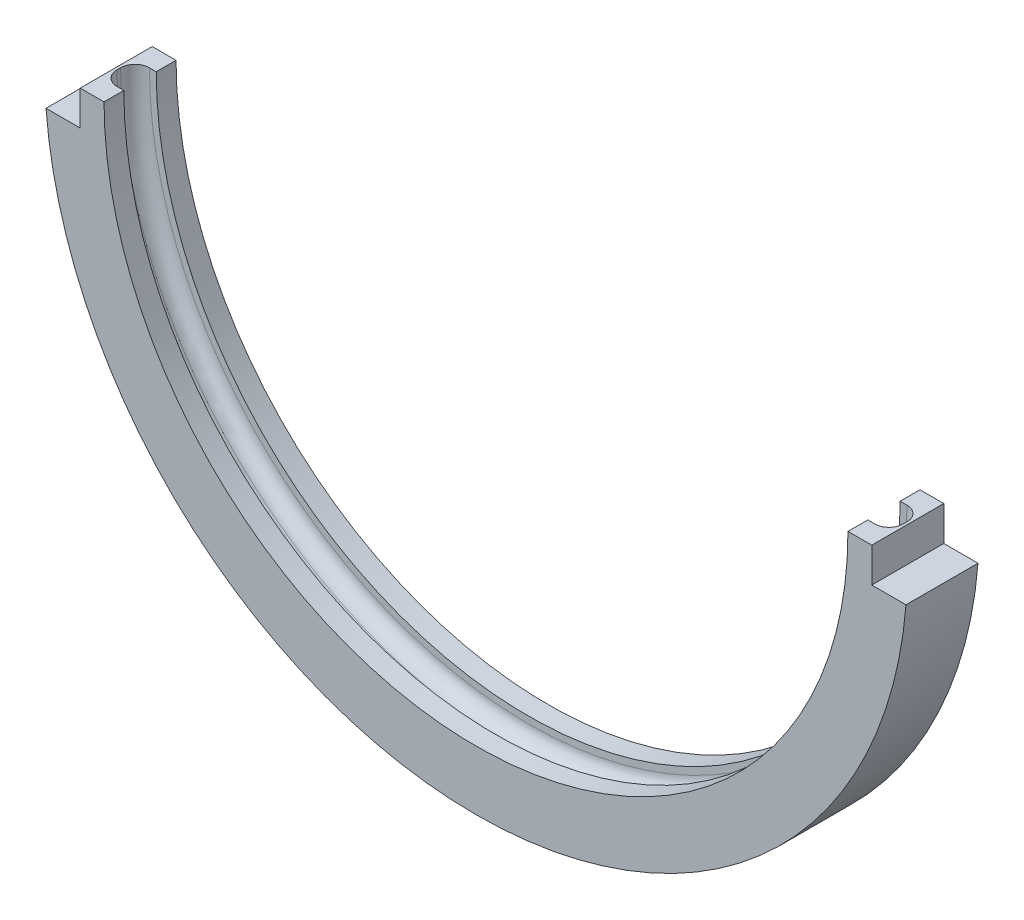
ISO-10303-21;
HEADER;
FILE_DESCRIPTION(('STEP AP214'),'2;1');
FILE_NAME('part.step','',(''),(''),'','','');
FILE_SCHEMA(('AUTOMOTIVE_DESIGN { 1 0 10303 214 1 1 1 1 }'));
ENDSEC;
DATA;
#1=APPLICATION_CONTEXT('core data for automotive mechanical design processes');
#2=APPLICATION_PROTOCOL_DEFINITION('international standard','automotive_design',2000,#1);
#3=PRODUCT_CONTEXT('',#1,'mechanical');
#4=PRODUCT('Part','Part','',(#3));
#5=PRODUCT_RELATED_PRODUCT_CATEGORY('part','',(#4));
#6=PRODUCT_DEFINITION_FORMATION('','',#4);
#7=PRODUCT_DEFINITION_CONTEXT('part definition',#1,'design');
#8=PRODUCT_DEFINITION('design','',#6,#7);
#9=PRODUCT_DEFINITION_SHAPE('','',#8);
#10=(LENGTH_UNIT() NAMED_UNIT(*) SI_UNIT(.MILLI.,.METRE.));
#11=(NAMED_UNIT(*) PLANE_ANGLE_UNIT() SI_UNIT($,.RADIAN.));
#12=(NAMED_UNIT(*) SI_UNIT($,.STERADIAN.) SOLID_ANGLE_UNIT());
#13=UNCERTAINTY_MEASURE_WITH_UNIT(LENGTH_MEASURE(1.E-05),#10,'distance_accuracy_value','');
#14=(GEOMETRIC_REPRESENTATION_CONTEXT(3) GLOBAL_UNCERTAINTY_ASSIGNED_CONTEXT((#13)) GLOBAL_UNIT_ASSIGNED_CONTEXT((#10,
#11,#12)) REPRESENTATION_CONTEXT('',''));
#15=CARTESIAN_POINT('',(0.,0.,0.));
#16=DIRECTION('',(0.,0.,1.));
#17=DIRECTION('',(1.,0.,0.));
#18=AXIS2_PLACEMENT_3D('',#15,#16,#17);
#19=CARTESIAN_POINT('',(0.,76.073,5.715));
#20=DIRECTION('',(0.,0.,-1.));
#21=DIRECTION('',(-1.,0.,0.));
#22=AXIS2_PLACEMENT_3D('',#19,#20,#21);
#23=CYLINDRICAL_SURFACE('',#22,76.073);
#24=CARTESIAN_POINT('',(0.,0.,1.33349999999999));
#25=CARTESIAN_POINT('',(0.0855945349997394,2.06101865915867E-07,1.33350379291589));
#26=CARTESIAN_POINT('',(0.171250915498614,0.000146012248360919,1.34073524768457));
#27=CARTESIAN_POINT('',(0.340204023150751,0.00071364506222568,1.36948225182749));
#28=CARTESIAN_POINT('',(0.423497794593289,0.00113580282824444,1.39101493604841));
#29=CARTESIAN_POINT('',(0.58525356893735,0.00220832220925467,1.44775060002442));
#30=CARTESIAN_POINT('',(0.663717883442069,0.00285857363366933,1.48294697981084));
#31=CARTESIAN_POINT('',(0.813602096244806,0.0043138981059449,1.56600169332678));
#32=CARTESIAN_POINT('',(0.885023725956289,0.00511893295668781,1.61385690423012));
#33=CARTESIAN_POINT('',(1.01883757249064,0.00679340697851409,1.72088761442366));
#34=CARTESIAN_POINT('',(1.08122770917481,0.00766286091714674,1.78006571434437));
#35=CARTESIAN_POINT('',(1.19519031708527,0.0093680471323975,1.90805861859076));
#36=CARTESIAN_POINT('',(1.24676236082598,0.010203778075371,1.97687380355443));
#37=CARTESIAN_POINT('',(1.3376251451231,0.0117473104519163,2.12219141461824));
#38=CARTESIAN_POINT('',(1.37691508154246,0.0124551035078293,2.19869434361906));
#39=CARTESIAN_POINT('',(1.44209293399731,0.0136628632197349,2.35721212766005));
#40=CARTESIAN_POINT('',(1.46798088892473,0.0141628304788274,2.43922696670414));
#41=CARTESIAN_POINT('',(1.50561666142446,0.0148984887564408,2.60642887018513));
#42=CARTESIAN_POINT('',(1.51736637556974,0.0151342152212277,2.69161550756052));
#43=CARTESIAN_POINT('',(1.52639796106279,0.0153149207245114,2.8627524189173));
#44=CARTESIAN_POINT('',(1.52367987260578,0.0152599005707755,2.94870269077645));
#45=CARTESIAN_POINT('',(1.50385466040848,0.0148653504340099,3.11891417148759));
#46=CARTESIAN_POINT('',(1.48674959902126,0.0145258612292591,3.20317562065764));
#47=CARTESIAN_POINT('',(1.43863917290202,0.0136007098296155,3.3676307436008));
#48=CARTESIAN_POINT('',(1.40763378638577,0.0130150472489263,3.44782441099877));
#49=CARTESIAN_POINT('',(1.33260048235792,0.0116635275432489,3.60187411392825));
#50=CARTESIAN_POINT('',(1.28857161888797,0.0108976573297322,3.67572968859041));
#51=CARTESIAN_POINT('',(1.18874191287519,0.00927207813996294,3.81500161578621));
#52=CARTESIAN_POINT('',(1.13294106097371,0.00841236908910922,3.88041796161065));
#53=CARTESIAN_POINT('',(1.01113968026977,0.00669585093085855,4.00096653225274));
#54=CARTESIAN_POINT('',(0.945137359360457,0.0058390423600706,4.05609694636289));
#55=CARTESIAN_POINT('',(0.804812955805773,0.00422506510297776,4.15449474589157));
#56=CARTESIAN_POINT('',(0.730490871968146,0.00346789643095172,4.19776212961007));
#57=CARTESIAN_POINT('',(0.575635722257035,0.00213855432188997,4.27120543008588));
#58=CARTESIAN_POINT('',(0.495102630444092,0.00156638165751761,4.30138129216468));
#59=CARTESIAN_POINT('',(0.330111987568197,0.000671548269268094,4.34778380786271));
#60=CARTESIAN_POINT('',(0.245654441366153,0.000348887236349569,4.3640104787592));
#61=CARTESIAN_POINT('',(0.0752280970382326,-1.05092405947312E-05,4.38205177674906));
#62=CARTESIAN_POINT('',(-0.0107404358431765,-4.72943757394238E-05,4.38386890851823));
#63=CARTESIAN_POINT('',(-0.181762198594427,0.000169076345192388,4.37304606986865));
#64=CARTESIAN_POINT('',(-0.266815428914038,0.000422232058788883,4.36040610655427));
#65=CARTESIAN_POINT('',(-0.433585227687398,0.0011899157446135,4.32102995718912));
#66=CARTESIAN_POINT('',(-0.515302064212906,0.00170442267303155,4.29429490605803));
#67=CARTESIAN_POINT('',(-0.673087615387558,0.00293681524962359,4.22748865692274));
#68=CARTESIAN_POINT('',(-0.749156325373015,0.00365470106572617,4.18741744790695));
#69=CARTESIAN_POINT('',(-0.893497817923817,0.00521306827912535,4.09506991635602));
#70=CARTESIAN_POINT('',(-0.961769521065522,0.00605356661440183,4.04279190694471));
#71=CARTESIAN_POINT('',(-1.08856816644544,0.00776235857443175,3.92751724418561));
#72=CARTESIAN_POINT('',(-1.14709509541133,0.00863065223704034,3.86452057623931));
#73=CARTESIAN_POINT('',(-1.25275113682792,0.0102972860680389,3.72958614285633));
#74=CARTESIAN_POINT('',(-1.2998786325906,0.0110956163038644,3.65764711138529));
#75=CARTESIAN_POINT('',(-1.38138693581098,0.012532160014725,3.50687658683567));
#76=CARTESIAN_POINT('',(-1.41576776354565,0.0131703737444674,3.4280451047216));
#77=CARTESIAN_POINT('',(-1.47080396987324,0.0142146587671107,3.26573353617285));
#78=CARTESIAN_POINT('',(-1.49146040078931,0.0146207478579197,3.18225380667632));
#79=CARTESIAN_POINT('',(-1.51846491163559,0.015155049642882,3.01301030152232));
#80=CARTESIAN_POINT('',(-1.52481298287515,0.0152832621682579,2.92724652447759));
#81=CARTESIAN_POINT('',(-1.5230204201675,0.0152473484650301,2.75588581915875));
#82=CARTESIAN_POINT('',(-1.51488234856612,0.0150832739369008,2.67028886405773));
#83=CARTESIAN_POINT('',(-1.4843537508379,0.0144813917127718,2.50167631198362));
#84=CARTESIAN_POINT('',(-1.46196319621411,0.0140435834694591,2.41866072017216));
#85=CARTESIAN_POINT('',(-1.40356528137836,0.0129435925449101,2.25756570290613));
#86=CARTESIAN_POINT('',(-1.36755767518963,0.0122814058105504,2.17948636664921));
#87=CARTESIAN_POINT('',(-1.28294952090296,0.0108073427394373,2.03048353282782));
#88=CARTESIAN_POINT('',(-1.23434944982934,0.00999547207330576,1.95955976433944));
#89=CARTESIAN_POINT('',(-1.12593166801518,0.00831346202115557,1.82687158382607));
#90=CARTESIAN_POINT('',(-1.06611316687766,0.00744331853229102,1.76510781772051));
#91=CARTESIAN_POINT('',(-0.936938606354715,0.00574266821983038,1.65248329537931));
#92=CARTESIAN_POINT('',(-0.867580184106196,0.00491217128481854,1.60162524830068));
#93=CARTESIAN_POINT('',(-0.721275855637611,0.00338424251398353,1.51225182287018));
#94=CARTESIAN_POINT('',(-0.644325772223447,0.00268688456219293,1.47374328973678));
#95=CARTESIAN_POINT('',(-0.485111216277927,0.00150529078577328,1.41023637854843));
#96=CARTESIAN_POINT('',(-0.402853232344317,0.00102080019868899,1.38522184248434));
#97=CARTESIAN_POINT('',(-0.266727553014035,0.00044943552346389,1.35606306091305));
#98=CARTESIAN_POINT('',(-0.213743956090708,0.000281625570785505,1.34761251136189));
#99=CARTESIAN_POINT('',(-0.10718165758212,5.68432813400188E-05,1.33632979362654));
#100=CARTESIAN_POINT('',(-0.0536029560740152,-1.29069797102052E-07,1.33349762471394));
#101=CARTESIAN_POINT('',(0.,0.,1.33349999999999));
#102=B_SPLINE_CURVE_WITH_KNOTS('',3,(#24,#25,#26,#27,#28,#29,#30,#31,#32,#33,#34,#35,#36,#37,
#38,#39,#40,#41,#42,#43,#44,#45,#46,#47,#48,#49,#50,#51,#52,#53,#54,#55,#56,#57,#58,#59,#60,#61,
#62,#63,#64,#65,#66,#67,#68,#69,#70,#71,#72,#73,#74,#75,#76,#77,#78,#79,#80,#81,#82,#83,#84,#85,
#86,#87,#88,#89,#90,#91,#92,#93,#94,#95,#96,#97,#98,#99,#100,#101),.UNSPECIFIED.,.T.,.F.,(4,2,2,
2,2,2,2,2,2,2,2,2,2,2,2,2,2,2,2,2,2,2,2,2,2,2,2,2,2,2,2,2,2,2,2,2,2,2,4),(0.,0.256587951195914,
0.513483886104433,0.770255886772825,1.02696460294593,1.28373235066598,1.5405102428578,
1.79730494335351,2.0540988986388,2.31085840248152,2.56761719298187,2.82433918372928,
3.08106157680606,3.33780262145724,3.59454387021671,3.85133027245316,4.10811671148822,
4.36490422301619,4.62169141649049,4.87843397406325,5.13517640547004,5.3918981674388,
5.64862014138162,5.90537761313974,6.16213543459716,6.41892964858623,6.67572345407407,
6.9324975675299,7.18927183694585,7.44600069198828,7.70273006034533,7.95946406645213,
8.21618834845273,8.47293072481965,8.72973680644864,8.98668498820558,9.2433248077216,
9.40401117000277,9.56469751145107),.UNSPECIFIED.);
#103=CARTESIAN_POINT('',(0.,0.,1.33349999999999));
#104=VERTEX_POINT('',#103);
#105=EDGE_CURVE('E224',#104,#104,#102,.T.);
#106=ORIENTED_EDGE('',*,*,#105,.F.);
#107=EDGE_LOOP('',(#106));
#108=FACE_BOUND('',#107,.T.);
#109=DIRECTION('',(0.,0.,1.));
#110=VECTOR('',#109,1.);
#111=CARTESIAN_POINT('',(-75.8283595563032,69.9769999999999,-3.4925));
#112=LINE('',#111,#110);
#113=CARTESIAN_POINT('',(-75.8283595563032,69.9769999999999,-3.4925));
#114=VERTEX_POINT('',#113);
#115=CARTESIAN_POINT('',(-75.8283595563032,69.9769999999999,9.2075));
#116=VERTEX_POINT('',#115);
#117=EDGE_CURVE('E12',#114,#116,#112,.T.);
#118=ORIENTED_EDGE('',*,*,#117,.F.);
#119=CARTESIAN_POINT('',(0.,76.073,-3.4925));
#120=DIRECTION('',(0.,0.,-1.));
#121=DIRECTION('',(-1.,0.,0.));
#122=AXIS2_PLACEMENT_3D('',#119,#120,#121);
#123=CIRCLE('',#122,76.073);
#124=CARTESIAN_POINT('',(75.8283595563032,69.977,-3.4925));
#125=VERTEX_POINT('',#124);
#126=EDGE_CURVE('E292',#125,#114,#123,.T.);
#127=ORIENTED_EDGE('',*,*,#126,.F.);
#128=DIRECTION('',(0.,0.,-1.));
#129=VECTOR('',#128,1.);
#130=CARTESIAN_POINT('',(75.8283595563032,69.977,5.715));
#131=LINE('',#130,#129);
#132=CARTESIAN_POINT('',(75.8283595563032,69.977,9.2075));
#133=VERTEX_POINT('',#132);
#134=EDGE_CURVE('E197',#125,#133,#131,.F.);
#135=ORIENTED_EDGE('',*,*,#134,.T.);
#136=CARTESIAN_POINT('',(0.,76.073,9.2075));
#137=DIRECTION('',(0.,0.,1.));
#138=DIRECTION('',(1.,0.,0.));
#139=AXIS2_PLACEMENT_3D('',#136,#137,#138);
#140=CIRCLE('',#139,76.073);
#141=EDGE_CURVE('E294',#116,#133,#140,.T.);
#142=ORIENTED_EDGE('',*,*,#141,.F.);
#143=EDGE_LOOP('',(#118,#127,#135,#142));
#144=FACE_BOUND('',#143,.T.);
#145=ADVANCED_FACE('F87',(#108,#144),#23,.T.);
#146=CARTESIAN_POINT('',(0.,76.073,5.715));
#147=DIRECTION('',(0.,-1.,0.));
#148=DIRECTION('',(0.,0.,-1.));
#149=AXIS2_PLACEMENT_3D('',#146,#147,#148);
#150=PLANE('',#149);
#151=DIRECTION('',(0.,0.,1.));
#152=VECTOR('',#151,1.);
#153=CARTESIAN_POINT('',(-69.7958595563032,76.073,-3.4925));
#154=LINE('',#153,#152);
#155=CARTESIAN_POINT('',(-69.7958595563032,76.073,-3.4925));
#156=VERTEX_POINT('',#155);
#157=CARTESIAN_POINT('',(-69.7958595563032,76.073,9.2075));
#158=VERTEX_POINT('',#157);
#159=EDGE_CURVE('E187',#156,#158,#154,.T.);
#160=ORIENTED_EDGE('',*,*,#159,.T.);
#161=DIRECTION('',(-1.,0.,0.));
#162=VECTOR('',#161,1.);
#163=CARTESIAN_POINT('',(0.,76.073,9.2075));
#164=LINE('',#163,#162);
#165=CARTESIAN_POINT('',(-65.5955,76.073,9.2075));
#166=VERTEX_POINT('',#165);
#167=EDGE_CURVE('E211',#166,#158,#164,.T.);
#168=ORIENTED_EDGE('',*,*,#167,.F.);
#169=DIRECTION('',(0.,0.,-1.));
#170=VECTOR('',#169,1.);
#171=CARTESIAN_POINT('',(-65.5955,76.073,9.2075));
#172=LINE('',#171,#170);
#173=CARTESIAN_POINT('',(-65.5955,76.073,5.715));
#174=VERTEX_POINT('',#173);
#175=EDGE_CURVE('E196',#166,#174,#172,.T.);
#176=ORIENTED_EDGE('',*,*,#175,.T.);
#177=DIRECTION('',(-1.,0.,0.));
#178=VECTOR('',#177,1.);
#179=CARTESIAN_POINT('',(0.,76.073,5.715));
#180=LINE('',#179,#178);
#181=CARTESIAN_POINT('',(-66.802,76.073,5.715));
#182=VERTEX_POINT('',#181);
#183=EDGE_CURVE('E322',#174,#182,#180,.T.);
#184=ORIENTED_EDGE('',*,*,#183,.T.);
#185=CARTESIAN_POINT('',(-66.802,76.073,3.175));
#186=DIRECTION('',(0.,-1.,0.));
#187=DIRECTION('',(0.,0.,-1.));
#188=AXIS2_PLACEMENT_3D('',#185,#186,#187);
#189=CIRCLE('',#188,2.54);
#190=CARTESIAN_POINT('',(-69.342,76.073,3.175));
#191=VERTEX_POINT('',#190);
#192=EDGE_CURVE('E218',#182,#191,#189,.T.);
#193=ORIENTED_EDGE('',*,*,#192,.T.);
#194=DIRECTION('',(0.,0.,-1.));
#195=VECTOR('',#194,1.);
#196=CARTESIAN_POINT('',(-69.342,76.073,5.715));
#197=LINE('',#196,#195);
#198=CARTESIAN_POINT('',(-69.342,76.073,2.54));
#199=VERTEX_POINT('',#198);
#200=EDGE_CURVE('E213',#191,#199,#197,.T.);
#201=ORIENTED_EDGE('',*,*,#200,.T.);
#202=CARTESIAN_POINT('',(-66.802,76.073,2.54));
#203=DIRECTION('',(0.,-1.,0.));
#204=DIRECTION('',(0.,0.,-1.));
#205=AXIS2_PLACEMENT_3D('',#202,#203,#204);
#206=CIRCLE('',#205,2.54);
#207=CARTESIAN_POINT('',(-66.802,76.073,0.));
#208=VERTEX_POINT('',#207);
#209=EDGE_CURVE('E212',#199,#208,#206,.T.);
#210=ORIENTED_EDGE('',*,*,#209,.T.);
#211=DIRECTION('',(-1.,0.,0.));
#212=VECTOR('',#211,1.);
#213=CARTESIAN_POINT('',(0.,76.073,0.));
#214=LINE('',#213,#212);
#215=CARTESIAN_POINT('',(-65.5955,76.073,0.));
#216=VERTEX_POINT('',#215);
#217=EDGE_CURVE('E342',#216,#208,#214,.T.);
#218=ORIENTED_EDGE('',*,*,#217,.F.);
#219=DIRECTION('',(0.,0.,1.));
#220=VECTOR('',#219,1.);
#221=CARTESIAN_POINT('',(-65.5955,76.073,-3.4925));
#222=LINE('',#221,#220);
#223=CARTESIAN_POINT('',(-65.5955,76.073,-3.4925));
#224=VERTEX_POINT('',#223);
#225=EDGE_CURVE('E209',#224,#216,#222,.T.);
#226=ORIENTED_EDGE('',*,*,#225,.F.);
#227=DIRECTION('',(-1.,0.,0.));
#228=VECTOR('',#227,1.);
#229=CARTESIAN_POINT('',(0.,76.073,-3.4925));
#230=LINE('',#229,#228);
#231=EDGE_CURVE('E91',#224,#156,#230,.T.);
#232=ORIENTED_EDGE('',*,*,#231,.T.);
#233=EDGE_LOOP('',(#160,#168,#176,#184,#193,#201,#210,#218,#226,#232));
#234=FACE_BOUND('',#233,.T.);
#235=ADVANCED_FACE('F207',(#234),#150,.F.);
#236=CARTESIAN_POINT('',(0.,0.,9.2075));
#237=DIRECTION('',(0.,0.,1.));
#238=DIRECTION('',(1.,0.,0.));
#239=AXIS2_PLACEMENT_3D('',#236,#237,#238);
#240=PLANE('',#239);
#241=ORIENTED_EDGE('',*,*,#167,.T.);
#242=DIRECTION('',(0.,-1.,0.));
#243=VECTOR('',#242,1.);
#244=CARTESIAN_POINT('',(-69.7958595563032,0.,9.2075));
#245=LINE('',#244,#243);
#246=CARTESIAN_POINT('',(-69.7958595563032,69.9769999999999,9.2075));
#247=VERTEX_POINT('',#246);
#248=EDGE_CURVE('E184',#158,#247,#245,.T.);
#249=ORIENTED_EDGE('',*,*,#248,.T.);
#250=DIRECTION('',(-1.,0.,0.));
#251=VECTOR('',#250,1.);
#252=CARTESIAN_POINT('',(0.,69.9769999999999,9.2075));
#253=LINE('',#252,#251);
#254=EDGE_CURVE('E308',#247,#116,#253,.T.);
#255=ORIENTED_EDGE('',*,*,#254,.T.);
#256=ORIENTED_EDGE('',*,*,#141,.T.);
#257=DIRECTION('',(1.,0.,0.));
#258=VECTOR('',#257,1.);
#259=CARTESIAN_POINT('',(0.,69.977,9.2075));
#260=LINE('',#259,#258);
#261=CARTESIAN_POINT('',(69.7958595563032,69.977,9.2075));
#262=VERTEX_POINT('',#261);
#263=EDGE_CURVE('E378',#262,#133,#260,.T.);
#264=ORIENTED_EDGE('',*,*,#263,.F.);
#265=DIRECTION('',(0.,-1.,0.));
#266=VECTOR('',#265,1.);
#267=CARTESIAN_POINT('',(69.7958595563032,0.,9.2075));
#268=LINE('',#267,#266);
#269=CARTESIAN_POINT('',(69.7958595563032,76.073,9.2075));
#270=VERTEX_POINT('',#269);
#271=EDGE_CURVE('E231',#270,#262,#268,.T.);
#272=ORIENTED_EDGE('',*,*,#271,.F.);
#273=DIRECTION('',(1.,0.,0.));
#274=VECTOR('',#273,1.);
#275=CARTESIAN_POINT('',(0.,76.073,9.2075));
#276=LINE('',#275,#274);
#277=CARTESIAN_POINT('',(65.5955,76.073,9.2075));
#278=VERTEX_POINT('',#277);
#279=EDGE_CURVE('E341',#278,#270,#276,.T.);
#280=ORIENTED_EDGE('',*,*,#279,.F.);
#281=CARTESIAN_POINT('',(0.,76.073,9.2075));
#282=DIRECTION('',(0.,0.,1.));
#283=DIRECTION('',(1.,0.,0.));
#284=AXIS2_PLACEMENT_3D('',#281,#282,#283);
#285=CIRCLE('',#284,65.5955);
#286=EDGE_CURVE('E319',#166,#278,#285,.T.);
#287=ORIENTED_EDGE('',*,*,#286,.F.);
#288=EDGE_LOOP('',(#241,#249,#255,#256,#264,#272,#280,#287));
#289=FACE_BOUND('',#288,.T.);
#290=ADVANCED_FACE('F278',(#289),#240,.T.);
#291=CARTESIAN_POINT('',(0.,0.,-3.4925));
#292=DIRECTION('',(0.,0.,-1.));
#293=DIRECTION('',(-1.,0.,0.));
#294=AXIS2_PLACEMENT_3D('',#291,#292,#293);
#295=PLANE('',#294);
#296=DIRECTION('',(-1.,0.,0.));
#297=VECTOR('',#296,1.);
#298=CARTESIAN_POINT('',(0.,69.9769999999999,-3.4925));
#299=LINE('',#298,#297);
#300=CARTESIAN_POINT('',(-69.7958595563032,69.9769999999999,-3.4925));
#301=VERTEX_POINT('',#300);
#302=EDGE_CURVE('E97',#301,#114,#299,.T.);
#303=ORIENTED_EDGE('',*,*,#302,.F.);
#304=DIRECTION('',(0.,-1.,0.));
#305=VECTOR('',#304,1.);
#306=CARTESIAN_POINT('',(-69.7958595563032,0.,-3.4925));
#307=LINE('',#306,#305);
#308=EDGE_CURVE('E190',#156,#301,#307,.T.);
#309=ORIENTED_EDGE('',*,*,#308,.F.);
#310=ORIENTED_EDGE('',*,*,#231,.F.);
#311=CARTESIAN_POINT('',(0.,76.073,-3.4925));
#312=DIRECTION('',(0.,0.,-1.));
#313=DIRECTION('',(-1.,0.,0.));
#314=AXIS2_PLACEMENT_3D('',#311,#312,#313);
#315=CIRCLE('',#314,65.5955);
#316=CARTESIAN_POINT('',(65.5955,76.073,-3.4925));
#317=VERTEX_POINT('',#316);
#318=EDGE_CURVE('E372',#317,#224,#315,.T.);
#319=ORIENTED_EDGE('',*,*,#318,.F.);
#320=DIRECTION('',(1.,0.,0.));
#321=VECTOR('',#320,1.);
#322=CARTESIAN_POINT('',(0.,76.073,-3.4925));
#323=LINE('',#322,#321);
#324=CARTESIAN_POINT('',(69.7958595563032,76.073,-3.4925));
#325=VERTEX_POINT('',#324);
#326=EDGE_CURVE('E307',#317,#325,#323,.T.);
#327=ORIENTED_EDGE('',*,*,#326,.T.);
#328=DIRECTION('',(0.,-1.,0.));
#329=VECTOR('',#328,1.);
#330=CARTESIAN_POINT('',(69.7958595563032,0.,-3.4925));
#331=LINE('',#330,#329);
#332=CARTESIAN_POINT('',(69.7958595563032,69.977,-3.4925));
#333=VERTEX_POINT('',#332);
#334=EDGE_CURVE('E303',#325,#333,#331,.T.);
#335=ORIENTED_EDGE('',*,*,#334,.T.);
#336=DIRECTION('',(1.,0.,0.));
#337=VECTOR('',#336,1.);
#338=CARTESIAN_POINT('',(0.,69.977,-3.4925));
#339=LINE('',#338,#337);
#340=EDGE_CURVE('E297',#333,#125,#339,.T.);
#341=ORIENTED_EDGE('',*,*,#340,.T.);
#342=ORIENTED_EDGE('',*,*,#126,.T.);
#343=EDGE_LOOP('',(#303,#309,#310,#319,#327,#335,#341,#342));
#344=FACE_BOUND('',#343,.T.);
#345=ADVANCED_FACE('F201',(#344),#295,.T.);
#346=CARTESIAN_POINT('',(0.,76.073,5.715));
#347=DIRECTION('',(0.,0.,-1.));
#348=DIRECTION('',(-1.,0.,0.));
#349=AXIS2_PLACEMENT_3D('',#346,#347,#348);
#350=CYLINDRICAL_SURFACE('',#349,69.342);
#351=ORIENTED_EDGE('',*,*,#200,.F.);
#352=CARTESIAN_POINT('',(0.,76.073,3.175));
#353=DIRECTION('',(0.,0.,1.));
#354=DIRECTION('',(1.,0.,0.));
#355=AXIS2_PLACEMENT_3D('',#352,#353,#354);
#356=CIRCLE('',#355,69.342);
#357=CARTESIAN_POINT('',(69.342,76.073,3.175));
#358=VERTEX_POINT('',#357);
#359=EDGE_CURVE('E298',#191,#358,#356,.T.);
#360=ORIENTED_EDGE('',*,*,#359,.T.);
#361=DIRECTION('',(0.,0.,-1.));
#362=VECTOR('',#361,1.);
#363=CARTESIAN_POINT('',(69.342,76.073,5.715));
#364=LINE('',#363,#362);
#365=CARTESIAN_POINT('',(69.342,76.073,2.54));
#366=VERTEX_POINT('',#365);
#367=EDGE_CURVE('E301',#358,#366,#364,.T.);
#368=ORIENTED_EDGE('',*,*,#367,.T.);
#369=CARTESIAN_POINT('',(0.,76.073,2.54));
#370=DIRECTION('',(0.,0.,-1.));
#371=DIRECTION('',(-1.,0.,0.));
#372=AXIS2_PLACEMENT_3D('',#369,#370,#371);
#373=CIRCLE('',#372,69.342);
#374=EDGE_CURVE('E345',#366,#199,#373,.T.);
#375=ORIENTED_EDGE('',*,*,#374,.T.);
#376=EDGE_LOOP('',(#351,#360,#368,#375));
#377=FACE_BOUND('',#376,.T.);
#378=ADVANCED_FACE('F260',(#377),#350,.F.);
#379=CARTESIAN_POINT('',(0.,76.073,5.715));
#380=DIRECTION('',(0.,1.,0.));
#381=DIRECTION('',(0.,0.,1.));
#382=AXIS2_PLACEMENT_3D('',#379,#380,#381);
#383=PLANE('',#382);
#384=DIRECTION('',(0.,0.,1.));
#385=VECTOR('',#384,1.);
#386=CARTESIAN_POINT('',(69.7958595563032,76.073,-3.4925));
#387=LINE('',#386,#385);
#388=EDGE_CURVE('E376',#325,#270,#387,.T.);
#389=ORIENTED_EDGE('',*,*,#388,.F.);
#390=ORIENTED_EDGE('',*,*,#326,.F.);
#391=DIRECTION('',(0.,0.,1.));
#392=VECTOR('',#391,1.);
#393=CARTESIAN_POINT('',(65.5955,76.073,-3.4925));
#394=LINE('',#393,#392);
#395=CARTESIAN_POINT('',(65.5955,76.073,0.));
#396=VERTEX_POINT('',#395);
#397=EDGE_CURVE('E347',#317,#396,#394,.T.);
#398=ORIENTED_EDGE('',*,*,#397,.T.);
#399=DIRECTION('',(1.,0.,0.));
#400=VECTOR('',#399,1.);
#401=CARTESIAN_POINT('',(0.,76.073,0.));
#402=LINE('',#401,#400);
#403=CARTESIAN_POINT('',(66.802,76.073,0.));
#404=VERTEX_POINT('',#403);
#405=EDGE_CURVE('E364',#396,#404,#402,.T.);
#406=ORIENTED_EDGE('',*,*,#405,.T.);
#407=CARTESIAN_POINT('',(66.802,76.073,2.54));
#408=DIRECTION('',(0.,1.,0.));
#409=DIRECTION('',(0.,0.,1.));
#410=AXIS2_PLACEMENT_3D('',#407,#408,#409);
#411=CIRCLE('',#410,2.54);
#412=EDGE_CURVE('E222',#404,#366,#411,.F.);
#413=ORIENTED_EDGE('',*,*,#412,.T.);
#414=ORIENTED_EDGE('',*,*,#367,.F.);
#415=CARTESIAN_POINT('',(66.802,76.073,3.175));
#416=DIRECTION('',(0.,1.,0.));
#417=DIRECTION('',(0.,0.,1.));
#418=AXIS2_PLACEMENT_3D('',#415,#416,#417);
#419=CIRCLE('',#418,2.54);
#420=CARTESIAN_POINT('',(66.802,76.073,5.715));
#421=VERTEX_POINT('',#420);
#422=EDGE_CURVE('E353',#358,#421,#419,.F.);
#423=ORIENTED_EDGE('',*,*,#422,.T.);
#424=DIRECTION('',(1.,0.,0.));
#425=VECTOR('',#424,1.);
#426=CARTESIAN_POINT('',(0.,76.073,5.715));
#427=LINE('',#426,#425);
#428=CARTESIAN_POINT('',(65.5955,76.073,5.715));
#429=VERTEX_POINT('',#428);
#430=EDGE_CURVE('E336',#429,#421,#427,.T.);
#431=ORIENTED_EDGE('',*,*,#430,.F.);
#432=DIRECTION('',(0.,0.,-1.));
#433=VECTOR('',#432,1.);
#434=CARTESIAN_POINT('',(65.5955,76.073,9.2075));
#435=LINE('',#434,#433);
#436=EDGE_CURVE('E333',#278,#429,#435,.T.);
#437=ORIENTED_EDGE('',*,*,#436,.F.);
#438=ORIENTED_EDGE('',*,*,#279,.T.);
#439=EDGE_LOOP('',(#389,#390,#398,#406,#413,#414,#423,#431,#437,#438));
#440=FACE_BOUND('',#439,.T.);
#441=ADVANCED_FACE('F255',(#440),#383,.T.);
#442=CARTESIAN_POINT('',(0.,0.,5.715));
#443=DIRECTION('',(0.,0.,1.));
#444=DIRECTION('',(1.,0.,0.));
#445=AXIS2_PLACEMENT_3D('',#442,#443,#444);
#446=PLANE('',#445);
#447=ORIENTED_EDGE('',*,*,#430,.T.);
#448=CARTESIAN_POINT('',(0.,76.073,5.715));
#449=DIRECTION('',(0.,0.,1.));
#450=DIRECTION('',(1.,0.,0.));
#451=AXIS2_PLACEMENT_3D('',#448,#449,#450);
#452=CIRCLE('',#451,66.802);
#453=EDGE_CURVE('E331',#421,#182,#452,.F.);
#454=ORIENTED_EDGE('',*,*,#453,.T.);
#455=ORIENTED_EDGE('',*,*,#183,.F.);
#456=CARTESIAN_POINT('',(0.,76.073,5.715));
#457=DIRECTION('',(0.,0.,1.));
#458=DIRECTION('',(1.,0.,0.));
#459=AXIS2_PLACEMENT_3D('',#456,#457,#458);
#460=CIRCLE('',#459,65.5955);
#461=EDGE_CURVE('E328',#174,#429,#460,.T.);
#462=ORIENTED_EDGE('',*,*,#461,.T.);
#463=EDGE_LOOP('',(#447,#454,#455,#462));
#464=FACE_BOUND('',#463,.T.);
#465=ADVANCED_FACE('F252',(#464),#446,.F.);
#466=CARTESIAN_POINT('',(0.,76.073,9.2075));
#467=DIRECTION('',(0.,0.,-1.));
#468=DIRECTION('',(-1.,0.,0.));
#469=AXIS2_PLACEMENT_3D('',#466,#467,#468);
#470=CYLINDRICAL_SURFACE('',#469,65.5955);
#471=ORIENTED_EDGE('',*,*,#461,.F.);
#472=ORIENTED_EDGE('',*,*,#175,.F.);
#473=ORIENTED_EDGE('',*,*,#286,.T.);
#474=ORIENTED_EDGE('',*,*,#436,.T.);
#475=EDGE_LOOP('',(#471,#472,#473,#474));
#476=FACE_BOUND('',#475,.T.);
#477=ADVANCED_FACE('F246',(#476),#470,.F.);
#478=CARTESIAN_POINT('',(0.,0.,0.));
#479=DIRECTION('',(0.,0.,-1.));
#480=DIRECTION('',(-1.,0.,0.));
#481=AXIS2_PLACEMENT_3D('',#478,#479,#480);
#482=PLANE('',#481);
#483=ORIENTED_EDGE('',*,*,#217,.T.);
#484=CARTESIAN_POINT('',(0.,76.073,0.));
#485=DIRECTION('',(0.,0.,-1.));
#486=DIRECTION('',(-1.,0.,0.));
#487=AXIS2_PLACEMENT_3D('',#484,#485,#486);
#488=CIRCLE('',#487,66.802);
#489=EDGE_CURVE('E349',#208,#404,#488,.F.);
#490=ORIENTED_EDGE('',*,*,#489,.T.);
#491=ORIENTED_EDGE('',*,*,#405,.F.);
#492=CARTESIAN_POINT('',(0.,76.073,0.));
#493=DIRECTION('',(0.,0.,-1.));
#494=DIRECTION('',(-1.,0.,0.));
#495=AXIS2_PLACEMENT_3D('',#492,#493,#494);
#496=CIRCLE('',#495,65.5955);
#497=EDGE_CURVE('E352',#396,#216,#496,.T.);
#498=ORIENTED_EDGE('',*,*,#497,.T.);
#499=EDGE_LOOP('',(#483,#490,#491,#498));
#500=FACE_BOUND('',#499,.T.);
#501=ADVANCED_FACE('F242',(#500),#482,.F.);
#502=CARTESIAN_POINT('',(0.,76.073,-3.4925));
#503=DIRECTION('',(0.,0.,1.));
#504=DIRECTION('',(1.,0.,0.));
#505=AXIS2_PLACEMENT_3D('',#502,#503,#504);
#506=CYLINDRICAL_SURFACE('',#505,65.5955);
#507=ORIENTED_EDGE('',*,*,#497,.F.);
#508=ORIENTED_EDGE('',*,*,#397,.F.);
#509=ORIENTED_EDGE('',*,*,#318,.T.);
#510=ORIENTED_EDGE('',*,*,#225,.T.);
#511=EDGE_LOOP('',(#507,#508,#509,#510));
#512=FACE_BOUND('',#511,.T.);
#513=ADVANCED_FACE('F245',(#512),#506,.F.);
#514=CARTESIAN_POINT('',(0.,76.073,3.175));
#515=DIRECTION('',(0.,0.,1.));
#516=DIRECTION('',(1.,0.,0.));
#517=AXIS2_PLACEMENT_3D('',#514,#515,#516);
#518=TOROIDAL_SURFACE('',#517,66.802,2.54);
#519=ORIENTED_EDGE('',*,*,#192,.F.);
#520=ORIENTED_EDGE('',*,*,#453,.F.);
#521=ORIENTED_EDGE('',*,*,#422,.F.);
#522=ORIENTED_EDGE('',*,*,#359,.F.);
#523=EDGE_LOOP('',(#519,#520,#521,#522));
#524=FACE_BOUND('',#523,.T.);
#525=ADVANCED_FACE('F250',(#524),#518,.F.);
#526=CARTESIAN_POINT('',(0.,76.073,2.54));
#527=DIRECTION('',(0.,0.,-1.));
#528=DIRECTION('',(-1.,0.,0.));
#529=AXIS2_PLACEMENT_3D('',#526,#527,#528);
#530=TOROIDAL_SURFACE('',#529,66.802,2.54);
#531=ORIENTED_EDGE('',*,*,#209,.F.);
#532=ORIENTED_EDGE('',*,*,#374,.F.);
#533=ORIENTED_EDGE('',*,*,#412,.F.);
#534=ORIENTED_EDGE('',*,*,#489,.F.);
#535=EDGE_LOOP('',(#531,#532,#533,#534));
#536=FACE_BOUND('',#535,.T.);
#537=ADVANCED_FACE('F239',(#536),#530,.F.);
#538=CARTESIAN_POINT('',(0.,6.35,2.85749999999999));
#539=DIRECTION('',(0.,-1.,0.));
#540=DIRECTION('',(0.,0.,-1.));
#541=AXIS2_PLACEMENT_3D('',#538,#539,#540);
#542=CYLINDRICAL_SURFACE('',#541,1.524);
#543=CARTESIAN_POINT('',(0.,6.35,2.85749999999999));
#544=DIRECTION('',(0.,1.,0.));
#545=DIRECTION('',(0.,0.,1.));
#546=AXIS2_PLACEMENT_3D('',#543,#544,#545);
#547=CIRCLE('',#546,1.524);
#548=CARTESIAN_POINT('',(0.,6.35,4.38149999999999));
#549=VERTEX_POINT('',#548);
#550=EDGE_CURVE('E232',#549,#549,#547,.T.);
#551=ORIENTED_EDGE('',*,*,#550,.T.);
#552=EDGE_LOOP('',(#551));
#553=FACE_BOUND('',#552,.T.);
#554=ORIENTED_EDGE('',*,*,#105,.T.);
#555=EDGE_LOOP('',(#554));
#556=FACE_BOUND('',#555,.T.);
#557=ADVANCED_FACE('F233',(#553,#556),#542,.F.);
#558=CARTESIAN_POINT('',(0.,6.35,2.85749999999999));
#559=DIRECTION('',(0.,1.,0.));
#560=DIRECTION('',(0.,0.,1.));
#561=AXIS2_PLACEMENT_3D('',#558,#559,#560);
#562=PLANE('',#561);
#563=ORIENTED_EDGE('',*,*,#550,.F.);
#564=EDGE_LOOP('',(#563));
#565=FACE_BOUND('',#564,.T.);
#566=ADVANCED_FACE('F238',(#565),#562,.F.);
#567=CARTESIAN_POINT('',(69.7958595563032,0.,-3.4925));
#568=DIRECTION('',(-1.,0.,0.));
#569=DIRECTION('',(0.,0.,1.));
#570=AXIS2_PLACEMENT_3D('',#567,#568,#569);
#571=PLANE('',#570);
#572=ORIENTED_EDGE('',*,*,#271,.T.);
#573=DIRECTION('',(0.,0.,1.));
#574=VECTOR('',#573,1.);
#575=CARTESIAN_POINT('',(69.7958595563032,69.977,-3.4925));
#576=LINE('',#575,#574);
#577=EDGE_CURVE('E205',#333,#262,#576,.T.);
#578=ORIENTED_EDGE('',*,*,#577,.F.);
#579=ORIENTED_EDGE('',*,*,#334,.F.);
#580=ORIENTED_EDGE('',*,*,#388,.T.);
#581=EDGE_LOOP('',(#572,#578,#579,#580));
#582=FACE_BOUND('',#581,.T.);
#583=ADVANCED_FACE('F388',(#582),#571,.F.);
#584=CARTESIAN_POINT('',(0.,69.977,-3.4925));
#585=DIRECTION('',(0.,-1.,0.));
#586=DIRECTION('',(0.,0.,-1.));
#587=AXIS2_PLACEMENT_3D('',#584,#585,#586);
#588=PLANE('',#587);
#589=ORIENTED_EDGE('',*,*,#263,.T.);
#590=ORIENTED_EDGE('',*,*,#134,.F.);
#591=ORIENTED_EDGE('',*,*,#340,.F.);
#592=ORIENTED_EDGE('',*,*,#577,.T.);
#593=EDGE_LOOP('',(#589,#590,#591,#592));
#594=FACE_BOUND('',#593,.T.);
#595=ADVANCED_FACE('F273',(#594),#588,.F.);
#596=CARTESIAN_POINT('',(-69.7958595563032,0.,-3.4925));
#597=DIRECTION('',(-1.,0.,0.));
#598=DIRECTION('',(0.,0.,1.));
#599=AXIS2_PLACEMENT_3D('',#596,#597,#598);
#600=PLANE('',#599);
#601=ORIENTED_EDGE('',*,*,#248,.F.);
#602=ORIENTED_EDGE('',*,*,#159,.F.);
#603=ORIENTED_EDGE('',*,*,#308,.T.);
#604=DIRECTION('',(0.,0.,1.));
#605=VECTOR('',#604,1.);
#606=CARTESIAN_POINT('',(-69.7958595563032,69.9769999999999,-3.4925));
#607=LINE('',#606,#605);
#608=EDGE_CURVE('E204',#301,#247,#607,.T.);
#609=ORIENTED_EDGE('',*,*,#608,.T.);
#610=EDGE_LOOP('',(#601,#602,#603,#609));
#611=FACE_BOUND('',#610,.T.);
#612=ADVANCED_FACE('F189',(#611),#600,.T.);
#613=CARTESIAN_POINT('',(0.,69.9769999999999,-3.4925));
#614=DIRECTION('',(0.,1.,0.));
#615=DIRECTION('',(0.,0.,1.));
#616=AXIS2_PLACEMENT_3D('',#613,#614,#615);
#617=PLANE('',#616);
#618=ORIENTED_EDGE('',*,*,#254,.F.);
#619=ORIENTED_EDGE('',*,*,#608,.F.);
#620=ORIENTED_EDGE('',*,*,#302,.T.);
#621=ORIENTED_EDGE('',*,*,#117,.T.);
#622=EDGE_LOOP('',(#618,#619,#620,#621));
#623=FACE_BOUND('',#622,.T.);
#624=ADVANCED_FACE('F272',(#623),#617,.T.);
#625=CLOSED_SHELL('',(#145,#235,#290,#345,#378,#441,#465,#477,#501,#513,#525,#537,#557,#566,
#583,#595,#612,#624));
#626=MANIFOLD_SOLID_BREP('B2',#625);
#627=ADVANCED_BREP_SHAPE_REPRESENTATION('',(#18,#626),#14);
#628=SHAPE_DEFINITION_REPRESENTATION(#9,#627);
ENDSEC;
END-ISO-10303-21;
